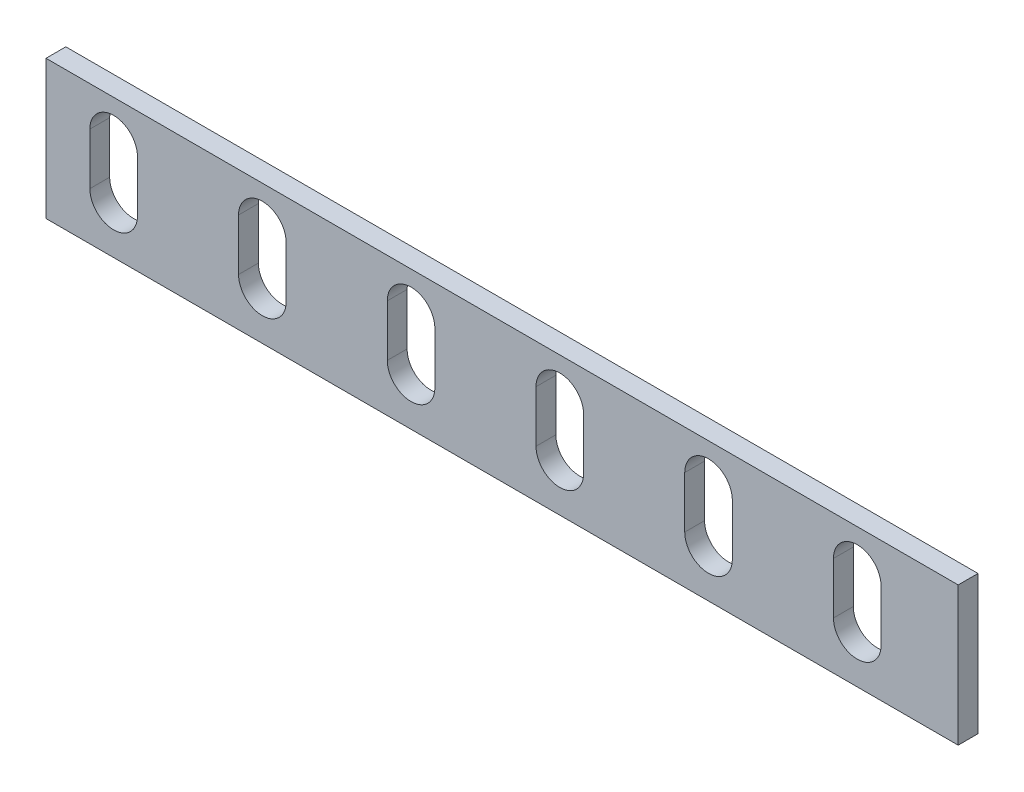
ISO-10303-21;
HEADER;
FILE_DESCRIPTION(('STEP AP214'),'2;1');
FILE_NAME('part.step','',(''),(''),'','','');
FILE_SCHEMA(('AUTOMOTIVE_DESIGN { 1 0 10303 214 1 1 1 1 }'));
ENDSEC;
DATA;
#1=APPLICATION_CONTEXT('core data for automotive mechanical design processes');
#2=APPLICATION_PROTOCOL_DEFINITION('international standard','automotive_design',2000,#1);
#3=PRODUCT_CONTEXT('',#1,'mechanical');
#4=PRODUCT('Part','Part','',(#3));
#5=PRODUCT_RELATED_PRODUCT_CATEGORY('part','',(#4));
#6=PRODUCT_DEFINITION_FORMATION('','',#4);
#7=PRODUCT_DEFINITION_CONTEXT('part definition',#1,'design');
#8=PRODUCT_DEFINITION('design','',#6,#7);
#9=PRODUCT_DEFINITION_SHAPE('','',#8);
#10=(LENGTH_UNIT() NAMED_UNIT(*) SI_UNIT(.MILLI.,.METRE.));
#11=(NAMED_UNIT(*) PLANE_ANGLE_UNIT() SI_UNIT($,.RADIAN.));
#12=(NAMED_UNIT(*) SI_UNIT($,.STERADIAN.) SOLID_ANGLE_UNIT());
#13=UNCERTAINTY_MEASURE_WITH_UNIT(LENGTH_MEASURE(1.E-05),#10,'distance_accuracy_value','');
#14=(GEOMETRIC_REPRESENTATION_CONTEXT(3) GLOBAL_UNCERTAINTY_ASSIGNED_CONTEXT((#13)) GLOBAL_UNIT_ASSIGNED_CONTEXT((#10,
#11,#12)) REPRESENTATION_CONTEXT('',''));
#15=CARTESIAN_POINT('',(0.,0.,0.));
#16=DIRECTION('',(0.,0.,1.));
#17=DIRECTION('',(1.,0.,0.));
#18=AXIS2_PLACEMENT_3D('',#15,#16,#17);
#19=CARTESIAN_POINT('',(0.,0.,20.));
#20=DIRECTION('',(0.,0.,1.));
#21=DIRECTION('',(1.,0.,0.));
#22=AXIS2_PLACEMENT_3D('',#19,#20,#21);
#23=PLANE('',#22);
#24=DIRECTION('',(0.,-1.,0.));
#25=VECTOR('',#24,1.);
#26=CARTESIAN_POINT('',(-450.373949579832,112.521008403362,20.));
#27=LINE('',#26,#25);
#28=CARTESIAN_POINT('',(-450.373949579832,112.521008403362,20.));
#29=VERTEX_POINT('',#28);
#30=CARTESIAN_POINT('',(-450.373949579832,-27.4789915966385,20.));
#31=VERTEX_POINT('',#30);
#32=EDGE_CURVE('E488',#29,#31,#27,.T.);
#33=ORIENTED_EDGE('',*,*,#32,.T.);
#34=DIRECTION('',(1.,0.,0.));
#35=VECTOR('',#34,1.);
#36=CARTESIAN_POINT('',(-450.373949579832,-27.4789915966385,20.));
#37=LINE('',#36,#35);
#38=CARTESIAN_POINT('',(469.626050420168,-27.4789915966385,20.));
#39=VERTEX_POINT('',#38);
#40=EDGE_CURVE('E492',#31,#39,#37,.T.);
#41=ORIENTED_EDGE('',*,*,#40,.T.);
#42=DIRECTION('',(0.,1.,0.));
#43=VECTOR('',#42,1.);
#44=CARTESIAN_POINT('',(469.626050420168,112.521008403362,20.));
#45=LINE('',#44,#43);
#46=CARTESIAN_POINT('',(469.626050420168,112.521008403362,20.));
#47=VERTEX_POINT('',#46);
#48=EDGE_CURVE('E496',#39,#47,#45,.T.);
#49=ORIENTED_EDGE('',*,*,#48,.T.);
#50=DIRECTION('',(-1.,0.,0.));
#51=VECTOR('',#50,1.);
#52=CARTESIAN_POINT('',(-450.373949579832,112.521008403362,20.));
#53=LINE('',#52,#51);
#54=EDGE_CURVE('E499',#47,#29,#53,.T.);
#55=ORIENTED_EDGE('',*,*,#54,.T.);
#56=EDGE_LOOP('',(#33,#41,#49,#55));
#57=FACE_BOUND('',#56,.T.);
#58=DIRECTION('',(0.,-1.,0.));
#59=VECTOR('',#58,1.);
#60=CARTESIAN_POINT('',(-406.161990973654,72.7410615098471,20.));
#61=LINE('',#60,#59);
#62=CARTESIAN_POINT('',(-406.161990973654,72.7410615098471,20.));
#63=VERTEX_POINT('',#62);
#64=CARTESIAN_POINT('',(-406.161990973654,20.7410615098471,20.));
#65=VERTEX_POINT('',#64);
#66=EDGE_CURVE('E448',#63,#65,#61,.T.);
#67=ORIENTED_EDGE('',*,*,#66,.F.);
#68=CARTESIAN_POINT('',(-382.161990973654,72.7410615098471,20.));
#69=DIRECTION('',(0.,0.,1.));
#70=DIRECTION('',(1.,0.,0.));
#71=AXIS2_PLACEMENT_3D('',#68,#69,#70);
#72=CIRCLE('',#71,24.);
#73=CARTESIAN_POINT('',(-358.161990973654,72.7410615098471,20.));
#74=VERTEX_POINT('',#73);
#75=EDGE_CURVE('E445',#74,#63,#72,.T.);
#76=ORIENTED_EDGE('',*,*,#75,.F.);
#77=DIRECTION('',(0.,1.,0.));
#78=VECTOR('',#77,1.);
#79=CARTESIAN_POINT('',(-358.161990973654,72.7410615098471,20.));
#80=LINE('',#79,#78);
#81=CARTESIAN_POINT('',(-358.161990973654,20.7410615098471,20.));
#82=VERTEX_POINT('',#81);
#83=EDGE_CURVE('E456',#82,#74,#80,.T.);
#84=ORIENTED_EDGE('',*,*,#83,.F.);
#85=CARTESIAN_POINT('',(-382.161990973654,20.7410615098471,20.));
#86=DIRECTION('',(0.,0.,1.));
#87=DIRECTION('',(1.,0.,0.));
#88=AXIS2_PLACEMENT_3D('',#85,#86,#87);
#89=CIRCLE('',#88,24.);
#90=EDGE_CURVE('E452',#65,#82,#89,.T.);
#91=ORIENTED_EDGE('',*,*,#90,.F.);
#92=EDGE_LOOP('',(#67,#76,#84,#91));
#93=FACE_BOUND('',#92,.T.);
#94=DIRECTION('',(0.,-1.,0.));
#95=VECTOR('',#94,1.);
#96=CARTESIAN_POINT('',(-256.161990973654,72.7410615098471,20.));
#97=LINE('',#96,#95);
#98=CARTESIAN_POINT('',(-256.161990973654,72.7410615098471,20.));
#99=VERTEX_POINT('',#98);
#100=CARTESIAN_POINT('',(-256.161990973654,20.7410615098471,20.));
#101=VERTEX_POINT('',#100);
#102=EDGE_CURVE('E405',#99,#101,#97,.T.);
#103=ORIENTED_EDGE('',*,*,#102,.F.);
#104=CARTESIAN_POINT('',(-232.161990973654,72.7410615098471,20.));
#105=DIRECTION('',(0.,0.,1.));
#106=DIRECTION('',(1.,0.,0.));
#107=AXIS2_PLACEMENT_3D('',#104,#105,#106);
#108=CIRCLE('',#107,24.);
#109=CARTESIAN_POINT('',(-208.161990973654,72.7410615098471,20.));
#110=VERTEX_POINT('',#109);
#111=EDGE_CURVE('E402',#110,#99,#108,.T.);
#112=ORIENTED_EDGE('',*,*,#111,.F.);
#113=DIRECTION('',(0.,1.,0.));
#114=VECTOR('',#113,1.);
#115=CARTESIAN_POINT('',(-208.161990973654,72.7410615098471,20.));
#116=LINE('',#115,#114);
#117=CARTESIAN_POINT('',(-208.161990973654,20.7410615098471,20.));
#118=VERTEX_POINT('',#117);
#119=EDGE_CURVE('E413',#118,#110,#116,.T.);
#120=ORIENTED_EDGE('',*,*,#119,.F.);
#121=CARTESIAN_POINT('',(-232.161990973654,20.7410615098471,20.));
#122=DIRECTION('',(0.,0.,1.));
#123=DIRECTION('',(1.,0.,0.));
#124=AXIS2_PLACEMENT_3D('',#121,#122,#123);
#125=CIRCLE('',#124,24.);
#126=EDGE_CURVE('E409',#101,#118,#125,.T.);
#127=ORIENTED_EDGE('',*,*,#126,.F.);
#128=EDGE_LOOP('',(#103,#112,#120,#127));
#129=FACE_BOUND('',#128,.T.);
#130=DIRECTION('',(0.,-1.,0.));
#131=VECTOR('',#130,1.);
#132=CARTESIAN_POINT('',(-106.161990973654,72.7410615098471,20.));
#133=LINE('',#132,#131);
#134=CARTESIAN_POINT('',(-106.161990973654,72.7410615098471,20.));
#135=VERTEX_POINT('',#134);
#136=CARTESIAN_POINT('',(-106.161990973654,20.7410615098471,20.));
#137=VERTEX_POINT('',#136);
#138=EDGE_CURVE('E362',#135,#137,#133,.T.);
#139=ORIENTED_EDGE('',*,*,#138,.F.);
#140=CARTESIAN_POINT('',(-82.1619909736538,72.7410615098471,20.));
#141=DIRECTION('',(0.,0.,1.));
#142=DIRECTION('',(1.,0.,0.));
#143=AXIS2_PLACEMENT_3D('',#140,#141,#142);
#144=CIRCLE('',#143,24.);
#145=CARTESIAN_POINT('',(-58.1619909736538,72.7410615098471,20.));
#146=VERTEX_POINT('',#145);
#147=EDGE_CURVE('E359',#146,#135,#144,.T.);
#148=ORIENTED_EDGE('',*,*,#147,.F.);
#149=DIRECTION('',(0.,1.,0.));
#150=VECTOR('',#149,1.);
#151=CARTESIAN_POINT('',(-58.1619909736538,72.7410615098471,20.));
#152=LINE('',#151,#150);
#153=CARTESIAN_POINT('',(-58.1619909736538,20.7410615098471,20.));
#154=VERTEX_POINT('',#153);
#155=EDGE_CURVE('E370',#154,#146,#152,.T.);
#156=ORIENTED_EDGE('',*,*,#155,.F.);
#157=CARTESIAN_POINT('',(-82.1619909736538,20.7410615098471,20.));
#158=DIRECTION('',(0.,0.,1.));
#159=DIRECTION('',(1.,0.,0.));
#160=AXIS2_PLACEMENT_3D('',#157,#158,#159);
#161=CIRCLE('',#160,24.);
#162=EDGE_CURVE('E366',#137,#154,#161,.T.);
#163=ORIENTED_EDGE('',*,*,#162,.F.);
#164=EDGE_LOOP('',(#139,#148,#156,#163));
#165=FACE_BOUND('',#164,.T.);
#166=DIRECTION('',(0.,-1.,0.));
#167=VECTOR('',#166,1.);
#168=CARTESIAN_POINT('',(43.8380090263462,72.7410615098471,20.));
#169=LINE('',#168,#167);
#170=CARTESIAN_POINT('',(43.8380090263462,72.7410615098471,20.));
#171=VERTEX_POINT('',#170);
#172=CARTESIAN_POINT('',(43.8380090263462,20.7410615098471,20.));
#173=VERTEX_POINT('',#172);
#174=EDGE_CURVE('E319',#171,#173,#169,.T.);
#175=ORIENTED_EDGE('',*,*,#174,.F.);
#176=CARTESIAN_POINT('',(67.8380090263462,72.7410615098471,20.));
#177=DIRECTION('',(0.,0.,1.));
#178=DIRECTION('',(1.,0.,0.));
#179=AXIS2_PLACEMENT_3D('',#176,#177,#178);
#180=CIRCLE('',#179,24.);
#181=CARTESIAN_POINT('',(91.8380090263462,72.7410615098471,20.));
#182=VERTEX_POINT('',#181);
#183=EDGE_CURVE('E316',#182,#171,#180,.T.);
#184=ORIENTED_EDGE('',*,*,#183,.F.);
#185=DIRECTION('',(0.,1.,0.));
#186=VECTOR('',#185,1.);
#187=CARTESIAN_POINT('',(91.8380090263462,72.7410615098471,20.));
#188=LINE('',#187,#186);
#189=CARTESIAN_POINT('',(91.8380090263462,20.7410615098471,20.));
#190=VERTEX_POINT('',#189);
#191=EDGE_CURVE('E327',#190,#182,#188,.T.);
#192=ORIENTED_EDGE('',*,*,#191,.F.);
#193=CARTESIAN_POINT('',(67.8380090263462,20.7410615098471,20.));
#194=DIRECTION('',(0.,0.,1.));
#195=DIRECTION('',(1.,0.,0.));
#196=AXIS2_PLACEMENT_3D('',#193,#194,#195);
#197=CIRCLE('',#196,24.);
#198=EDGE_CURVE('E323',#173,#190,#197,.T.);
#199=ORIENTED_EDGE('',*,*,#198,.F.);
#200=EDGE_LOOP('',(#175,#184,#192,#199));
#201=FACE_BOUND('',#200,.T.);
#202=DIRECTION('',(0.,-1.,0.));
#203=VECTOR('',#202,1.);
#204=CARTESIAN_POINT('',(193.838009026346,72.7410615098471,20.));
#205=LINE('',#204,#203);
#206=CARTESIAN_POINT('',(193.838009026346,72.7410615098471,20.));
#207=VERTEX_POINT('',#206);
#208=CARTESIAN_POINT('',(193.838009026346,20.7410615098471,20.));
#209=VERTEX_POINT('',#208);
#210=EDGE_CURVE('E276',#207,#209,#205,.T.);
#211=ORIENTED_EDGE('',*,*,#210,.F.);
#212=CARTESIAN_POINT('',(217.838009026346,72.7410615098471,20.));
#213=DIRECTION('',(0.,0.,1.));
#214=DIRECTION('',(1.,0.,0.));
#215=AXIS2_PLACEMENT_3D('',#212,#213,#214);
#216=CIRCLE('',#215,24.);
#217=CARTESIAN_POINT('',(241.838009026346,72.7410615098471,20.));
#218=VERTEX_POINT('',#217);
#219=EDGE_CURVE('E273',#218,#207,#216,.T.);
#220=ORIENTED_EDGE('',*,*,#219,.F.);
#221=DIRECTION('',(0.,1.,0.));
#222=VECTOR('',#221,1.);
#223=CARTESIAN_POINT('',(241.838009026346,72.7410615098471,20.));
#224=LINE('',#223,#222);
#225=CARTESIAN_POINT('',(241.838009026346,20.7410615098471,20.));
#226=VERTEX_POINT('',#225);
#227=EDGE_CURVE('E284',#226,#218,#224,.T.);
#228=ORIENTED_EDGE('',*,*,#227,.F.);
#229=CARTESIAN_POINT('',(217.838009026346,20.7410615098471,20.));
#230=DIRECTION('',(0.,0.,1.));
#231=DIRECTION('',(1.,0.,0.));
#232=AXIS2_PLACEMENT_3D('',#229,#230,#231);
#233=CIRCLE('',#232,24.);
#234=EDGE_CURVE('E280',#209,#226,#233,.T.);
#235=ORIENTED_EDGE('',*,*,#234,.F.);
#236=EDGE_LOOP('',(#211,#220,#228,#235));
#237=FACE_BOUND('',#236,.T.);
#238=DIRECTION('',(0.,-1.,0.));
#239=VECTOR('',#238,1.);
#240=CARTESIAN_POINT('',(343.838009026346,72.7410615098471,20.));
#241=LINE('',#240,#239);
#242=CARTESIAN_POINT('',(343.838009026346,72.7410615098471,20.));
#243=VERTEX_POINT('',#242);
#244=CARTESIAN_POINT('',(343.838009026346,20.7410615098471,20.));
#245=VERTEX_POINT('',#244);
#246=EDGE_CURVE('E234',#243,#245,#241,.T.);
#247=ORIENTED_EDGE('',*,*,#246,.F.);
#248=CARTESIAN_POINT('',(367.838009026346,72.7410615098471,20.));
#249=DIRECTION('',(0.,0.,1.));
#250=DIRECTION('',(1.,0.,0.));
#251=AXIS2_PLACEMENT_3D('',#248,#249,#250);
#252=CIRCLE('',#251,24.);
#253=CARTESIAN_POINT('',(391.838009026346,72.7410615098471,20.));
#254=VERTEX_POINT('',#253);
#255=EDGE_CURVE('E225',#254,#243,#252,.T.);
#256=ORIENTED_EDGE('',*,*,#255,.F.);
#257=DIRECTION('',(0.,1.,0.));
#258=VECTOR('',#257,1.);
#259=CARTESIAN_POINT('',(391.838009026346,72.7410615098471,20.));
#260=LINE('',#259,#258);
#261=CARTESIAN_POINT('',(391.838009026346,20.7410615098471,20.));
#262=VERTEX_POINT('',#261);
#263=EDGE_CURVE('E251',#262,#254,#260,.T.);
#264=ORIENTED_EDGE('',*,*,#263,.F.);
#265=CARTESIAN_POINT('',(367.838009026346,20.7410615098471,20.));
#266=DIRECTION('',(0.,0.,1.));
#267=DIRECTION('',(1.,0.,0.));
#268=AXIS2_PLACEMENT_3D('',#265,#266,#267);
#269=CIRCLE('',#268,24.);
#270=EDGE_CURVE('E247',#245,#262,#269,.T.);
#271=ORIENTED_EDGE('',*,*,#270,.F.);
#272=EDGE_LOOP('',(#247,#256,#264,#271));
#273=FACE_BOUND('',#272,.T.);
#274=ADVANCED_FACE('F39',(#57,#93,#129,#165,#201,#237,#273),#23,.T.);
#275=CARTESIAN_POINT('',(0.,0.,0.));
#276=DIRECTION('',(0.,0.,1.));
#277=DIRECTION('',(1.,0.,0.));
#278=AXIS2_PLACEMENT_3D('',#275,#276,#277);
#279=PLANE('',#278);
#280=CARTESIAN_POINT('',(217.838009026346,72.7410615098471,0.));
#281=DIRECTION('',(0.,0.,1.));
#282=DIRECTION('',(1.,0.,0.));
#283=AXIS2_PLACEMENT_3D('',#280,#281,#282);
#284=CIRCLE('',#283,24.);
#285=CARTESIAN_POINT('',(241.838009026346,72.7410615098471,0.));
#286=VERTEX_POINT('',#285);
#287=CARTESIAN_POINT('',(193.838009026346,72.7410615098471,0.));
#288=VERTEX_POINT('',#287);
#289=EDGE_CURVE('E243',#286,#288,#284,.T.);
#290=ORIENTED_EDGE('',*,*,#289,.T.);
#291=DIRECTION('',(0.,-1.,0.));
#292=VECTOR('',#291,1.);
#293=CARTESIAN_POINT('',(193.838009026346,72.7410615098471,0.));
#294=LINE('',#293,#292);
#295=CARTESIAN_POINT('',(193.838009026346,20.7410615098471,0.));
#296=VERTEX_POINT('',#295);
#297=EDGE_CURVE('E291',#288,#296,#294,.T.);
#298=ORIENTED_EDGE('',*,*,#297,.T.);
#299=CARTESIAN_POINT('',(217.838009026346,20.7410615098471,0.));
#300=DIRECTION('',(0.,0.,1.));
#301=DIRECTION('',(1.,0.,0.));
#302=AXIS2_PLACEMENT_3D('',#299,#300,#301);
#303=CIRCLE('',#302,24.);
#304=CARTESIAN_POINT('',(241.838009026346,20.7410615098471,0.));
#305=VERTEX_POINT('',#304);
#306=EDGE_CURVE('E295',#296,#305,#303,.T.);
#307=ORIENTED_EDGE('',*,*,#306,.T.);
#308=DIRECTION('',(0.,1.,0.));
#309=VECTOR('',#308,1.);
#310=CARTESIAN_POINT('',(241.838009026346,72.7410615098471,0.));
#311=LINE('',#310,#309);
#312=EDGE_CURVE('E277',#305,#286,#311,.T.);
#313=ORIENTED_EDGE('',*,*,#312,.T.);
#314=EDGE_LOOP('',(#290,#298,#307,#313));
#315=FACE_BOUND('',#314,.T.);
#316=CARTESIAN_POINT('',(-82.1619909736538,72.7410615098471,0.));
#317=DIRECTION('',(0.,0.,1.));
#318=DIRECTION('',(1.,0.,0.));
#319=AXIS2_PLACEMENT_3D('',#316,#317,#318);
#320=CIRCLE('',#319,24.);
#321=CARTESIAN_POINT('',(-58.1619909736538,72.7410615098471,0.));
#322=VERTEX_POINT('',#321);
#323=CARTESIAN_POINT('',(-106.161990973654,72.7410615098471,0.));
#324=VERTEX_POINT('',#323);
#325=EDGE_CURVE('E358',#322,#324,#320,.T.);
#326=ORIENTED_EDGE('',*,*,#325,.T.);
#327=DIRECTION('',(0.,-1.,0.));
#328=VECTOR('',#327,1.);
#329=CARTESIAN_POINT('',(-106.161990973654,72.7410615098471,0.));
#330=LINE('',#329,#328);
#331=CARTESIAN_POINT('',(-106.161990973654,20.7410615098471,0.));
#332=VERTEX_POINT('',#331);
#333=EDGE_CURVE('E377',#324,#332,#330,.T.);
#334=ORIENTED_EDGE('',*,*,#333,.T.);
#335=CARTESIAN_POINT('',(-82.1619909736538,20.7410615098471,0.));
#336=DIRECTION('',(0.,0.,1.));
#337=DIRECTION('',(1.,0.,0.));
#338=AXIS2_PLACEMENT_3D('',#335,#336,#337);
#339=CIRCLE('',#338,24.);
#340=CARTESIAN_POINT('',(-58.1619909736538,20.7410615098471,0.));
#341=VERTEX_POINT('',#340);
#342=EDGE_CURVE('E381',#332,#341,#339,.T.);
#343=ORIENTED_EDGE('',*,*,#342,.T.);
#344=DIRECTION('',(0.,1.,0.));
#345=VECTOR('',#344,1.);
#346=CARTESIAN_POINT('',(-58.1619909736538,72.7410615098471,0.));
#347=LINE('',#346,#345);
#348=EDGE_CURVE('E363',#341,#322,#347,.T.);
#349=ORIENTED_EDGE('',*,*,#348,.T.);
#350=EDGE_LOOP('',(#326,#334,#343,#349));
#351=FACE_BOUND('',#350,.T.);
#352=CARTESIAN_POINT('',(-382.161990973654,72.7410615098471,0.));
#353=DIRECTION('',(0.,0.,1.));
#354=DIRECTION('',(1.,0.,0.));
#355=AXIS2_PLACEMENT_3D('',#352,#353,#354);
#356=CIRCLE('',#355,24.);
#357=CARTESIAN_POINT('',(-358.161990973654,72.7410615098471,0.));
#358=VERTEX_POINT('',#357);
#359=CARTESIAN_POINT('',(-406.161990973654,72.7410615098471,0.));
#360=VERTEX_POINT('',#359);
#361=EDGE_CURVE('E444',#358,#360,#356,.T.);
#362=ORIENTED_EDGE('',*,*,#361,.T.);
#363=DIRECTION('',(0.,-1.,0.));
#364=VECTOR('',#363,1.);
#365=CARTESIAN_POINT('',(-406.161990973654,72.7410615098471,0.));
#366=LINE('',#365,#364);
#367=CARTESIAN_POINT('',(-406.161990973654,20.7410615098471,0.));
#368=VERTEX_POINT('',#367);
#369=EDGE_CURVE('E463',#360,#368,#366,.T.);
#370=ORIENTED_EDGE('',*,*,#369,.T.);
#371=CARTESIAN_POINT('',(-382.161990973654,20.7410615098471,0.));
#372=DIRECTION('',(0.,0.,1.));
#373=DIRECTION('',(1.,0.,0.));
#374=AXIS2_PLACEMENT_3D('',#371,#372,#373);
#375=CIRCLE('',#374,24.);
#376=CARTESIAN_POINT('',(-358.161990973654,20.7410615098471,0.));
#377=VERTEX_POINT('',#376);
#378=EDGE_CURVE('E467',#368,#377,#375,.T.);
#379=ORIENTED_EDGE('',*,*,#378,.T.);
#380=DIRECTION('',(0.,1.,0.));
#381=VECTOR('',#380,1.);
#382=CARTESIAN_POINT('',(-358.161990973654,72.7410615098471,0.));
#383=LINE('',#382,#381);
#384=EDGE_CURVE('E449',#377,#358,#383,.T.);
#385=ORIENTED_EDGE('',*,*,#384,.T.);
#386=EDGE_LOOP('',(#362,#370,#379,#385));
#387=FACE_BOUND('',#386,.T.);
#388=DIRECTION('',(0.,-1.,0.));
#389=VECTOR('',#388,1.);
#390=CARTESIAN_POINT('',(-450.373949579832,112.521008403362,0.));
#391=LINE('',#390,#389);
#392=CARTESIAN_POINT('',(-450.373949579832,112.521008403362,0.));
#393=VERTEX_POINT('',#392);
#394=CARTESIAN_POINT('',(-450.373949579832,-27.4789915966385,0.));
#395=VERTEX_POINT('',#394);
#396=EDGE_CURVE('E487',#393,#395,#391,.T.);
#397=ORIENTED_EDGE('',*,*,#396,.F.);
#398=DIRECTION('',(-1.,0.,0.));
#399=VECTOR('',#398,1.);
#400=CARTESIAN_POINT('',(-450.373949579832,112.521008403362,0.));
#401=LINE('',#400,#399);
#402=CARTESIAN_POINT('',(469.626050420168,112.521008403362,0.));
#403=VERTEX_POINT('',#402);
#404=EDGE_CURVE('E493',#403,#393,#401,.T.);
#405=ORIENTED_EDGE('',*,*,#404,.F.);
#406=DIRECTION('',(0.,1.,0.));
#407=VECTOR('',#406,1.);
#408=CARTESIAN_POINT('',(469.626050420168,112.521008403362,0.));
#409=LINE('',#408,#407);
#410=CARTESIAN_POINT('',(469.626050420168,-27.4789915966385,0.));
#411=VERTEX_POINT('',#410);
#412=EDGE_CURVE('E509',#411,#403,#409,.T.);
#413=ORIENTED_EDGE('',*,*,#412,.F.);
#414=DIRECTION('',(1.,0.,0.));
#415=VECTOR('',#414,1.);
#416=CARTESIAN_POINT('',(-450.373949579832,-27.4789915966385,0.));
#417=LINE('',#416,#415);
#418=EDGE_CURVE('E506',#395,#411,#417,.T.);
#419=ORIENTED_EDGE('',*,*,#418,.F.);
#420=EDGE_LOOP('',(#397,#405,#413,#419));
#421=FACE_BOUND('',#420,.T.);
#422=CARTESIAN_POINT('',(-232.161990973654,72.7410615098471,0.));
#423=DIRECTION('',(0.,0.,1.));
#424=DIRECTION('',(1.,0.,0.));
#425=AXIS2_PLACEMENT_3D('',#422,#423,#424);
#426=CIRCLE('',#425,24.);
#427=CARTESIAN_POINT('',(-208.161990973654,72.7410615098471,0.));
#428=VERTEX_POINT('',#427);
#429=CARTESIAN_POINT('',(-256.161990973654,72.7410615098471,0.));
#430=VERTEX_POINT('',#429);
#431=EDGE_CURVE('E401',#428,#430,#426,.T.);
#432=ORIENTED_EDGE('',*,*,#431,.T.);
#433=DIRECTION('',(0.,-1.,0.));
#434=VECTOR('',#433,1.);
#435=CARTESIAN_POINT('',(-256.161990973654,72.7410615098471,0.));
#436=LINE('',#435,#434);
#437=CARTESIAN_POINT('',(-256.161990973654,20.7410615098471,0.));
#438=VERTEX_POINT('',#437);
#439=EDGE_CURVE('E420',#430,#438,#436,.T.);
#440=ORIENTED_EDGE('',*,*,#439,.T.);
#441=CARTESIAN_POINT('',(-232.161990973654,20.7410615098471,0.));
#442=DIRECTION('',(0.,0.,1.));
#443=DIRECTION('',(1.,0.,0.));
#444=AXIS2_PLACEMENT_3D('',#441,#442,#443);
#445=CIRCLE('',#444,24.);
#446=CARTESIAN_POINT('',(-208.161990973654,20.7410615098471,0.));
#447=VERTEX_POINT('',#446);
#448=EDGE_CURVE('E424',#438,#447,#445,.T.);
#449=ORIENTED_EDGE('',*,*,#448,.T.);
#450=DIRECTION('',(0.,1.,0.));
#451=VECTOR('',#450,1.);
#452=CARTESIAN_POINT('',(-208.161990973654,72.7410615098471,0.));
#453=LINE('',#452,#451);
#454=EDGE_CURVE('E406',#447,#428,#453,.T.);
#455=ORIENTED_EDGE('',*,*,#454,.T.);
#456=EDGE_LOOP('',(#432,#440,#449,#455));
#457=FACE_BOUND('',#456,.T.);
#458=CARTESIAN_POINT('',(67.8380090263462,72.7410615098471,0.));
#459=DIRECTION('',(0.,0.,1.));
#460=DIRECTION('',(1.,0.,0.));
#461=AXIS2_PLACEMENT_3D('',#458,#459,#460);
#462=CIRCLE('',#461,24.);
#463=CARTESIAN_POINT('',(91.8380090263462,72.7410615098471,0.));
#464=VERTEX_POINT('',#463);
#465=CARTESIAN_POINT('',(43.8380090263462,72.7410615098471,0.));
#466=VERTEX_POINT('',#465);
#467=EDGE_CURVE('E315',#464,#466,#462,.T.);
#468=ORIENTED_EDGE('',*,*,#467,.T.);
#469=DIRECTION('',(0.,-1.,0.));
#470=VECTOR('',#469,1.);
#471=CARTESIAN_POINT('',(43.8380090263462,72.7410615098471,0.));
#472=LINE('',#471,#470);
#473=CARTESIAN_POINT('',(43.8380090263462,20.7410615098471,0.));
#474=VERTEX_POINT('',#473);
#475=EDGE_CURVE('E334',#466,#474,#472,.T.);
#476=ORIENTED_EDGE('',*,*,#475,.T.);
#477=CARTESIAN_POINT('',(67.8380090263462,20.7410615098471,0.));
#478=DIRECTION('',(0.,0.,1.));
#479=DIRECTION('',(1.,0.,0.));
#480=AXIS2_PLACEMENT_3D('',#477,#478,#479);
#481=CIRCLE('',#480,24.);
#482=CARTESIAN_POINT('',(91.8380090263462,20.7410615098471,0.));
#483=VERTEX_POINT('',#482);
#484=EDGE_CURVE('E338',#474,#483,#481,.T.);
#485=ORIENTED_EDGE('',*,*,#484,.T.);
#486=DIRECTION('',(0.,1.,0.));
#487=VECTOR('',#486,1.);
#488=CARTESIAN_POINT('',(91.8380090263462,72.7410615098471,0.));
#489=LINE('',#488,#487);
#490=EDGE_CURVE('E320',#483,#464,#489,.T.);
#491=ORIENTED_EDGE('',*,*,#490,.T.);
#492=EDGE_LOOP('',(#468,#476,#485,#491));
#493=FACE_BOUND('',#492,.T.);
#494=CARTESIAN_POINT('',(367.838009026346,72.7410615098471,0.));
#495=DIRECTION('',(0.,0.,1.));
#496=DIRECTION('',(1.,0.,0.));
#497=AXIS2_PLACEMENT_3D('',#494,#495,#496);
#498=CIRCLE('',#497,24.);
#499=CARTESIAN_POINT('',(391.838009026346,72.7410615098471,0.));
#500=VERTEX_POINT('',#499);
#501=CARTESIAN_POINT('',(343.838009026346,72.7410615098471,0.));
#502=VERTEX_POINT('',#501);
#503=EDGE_CURVE('E63',#500,#502,#498,.T.);
#504=ORIENTED_EDGE('',*,*,#503,.T.);
#505=DIRECTION('',(0.,-1.,0.));
#506=VECTOR('',#505,1.);
#507=CARTESIAN_POINT('',(343.838009026346,72.7410615098471,0.));
#508=LINE('',#507,#506);
#509=CARTESIAN_POINT('',(343.838009026346,20.7410615098471,0.));
#510=VERTEX_POINT('',#509);
#511=EDGE_CURVE('E241',#502,#510,#508,.T.);
#512=ORIENTED_EDGE('',*,*,#511,.T.);
#513=CARTESIAN_POINT('',(367.838009026346,20.7410615098471,0.));
#514=DIRECTION('',(0.,0.,1.));
#515=DIRECTION('',(1.,0.,0.));
#516=AXIS2_PLACEMENT_3D('',#513,#514,#515);
#517=CIRCLE('',#516,24.);
#518=CARTESIAN_POINT('',(391.838009026346,20.7410615098471,0.));
#519=VERTEX_POINT('',#518);
#520=EDGE_CURVE('E260',#510,#519,#517,.T.);
#521=ORIENTED_EDGE('',*,*,#520,.T.);
#522=DIRECTION('',(0.,1.,0.));
#523=VECTOR('',#522,1.);
#524=CARTESIAN_POINT('',(391.838009026346,72.7410615098471,0.));
#525=LINE('',#524,#523);
#526=EDGE_CURVE('E235',#519,#500,#525,.T.);
#527=ORIENTED_EDGE('',*,*,#526,.T.);
#528=EDGE_LOOP('',(#504,#512,#521,#527));
#529=FACE_BOUND('',#528,.T.);
#530=ADVANCED_FACE('F532',(#315,#351,#387,#421,#457,#493,#529),#279,.F.);
#531=CARTESIAN_POINT('',(-450.373949579832,112.521008403362,20.));
#532=DIRECTION('',(1.,0.,0.));
#533=DIRECTION('',(0.,0.,-1.));
#534=AXIS2_PLACEMENT_3D('',#531,#532,#533);
#535=PLANE('',#534);
#536=ORIENTED_EDGE('',*,*,#396,.T.);
#537=DIRECTION('',(0.,0.,-1.));
#538=VECTOR('',#537,1.);
#539=CARTESIAN_POINT('',(-450.373949579832,-27.4789915966385,20.));
#540=LINE('',#539,#538);
#541=EDGE_CURVE('E11',#31,#395,#540,.T.);
#542=ORIENTED_EDGE('',*,*,#541,.F.);
#543=ORIENTED_EDGE('',*,*,#32,.F.);
#544=DIRECTION('',(0.,0.,-1.));
#545=VECTOR('',#544,1.);
#546=CARTESIAN_POINT('',(-450.373949579832,112.521008403362,20.));
#547=LINE('',#546,#545);
#548=EDGE_CURVE('E502',#29,#393,#547,.T.);
#549=ORIENTED_EDGE('',*,*,#548,.T.);
#550=EDGE_LOOP('',(#536,#542,#543,#549));
#551=FACE_BOUND('',#550,.T.);
#552=ADVANCED_FACE('F41',(#551),#535,.F.);
#553=CARTESIAN_POINT('',(-450.373949579832,-27.4789915966385,20.));
#554=DIRECTION('',(0.,1.,0.));
#555=DIRECTION('',(0.,0.,1.));
#556=AXIS2_PLACEMENT_3D('',#553,#554,#555);
#557=PLANE('',#556);
#558=ORIENTED_EDGE('',*,*,#418,.T.);
#559=DIRECTION('',(0.,0.,-1.));
#560=VECTOR('',#559,1.);
#561=CARTESIAN_POINT('',(469.626050420168,-27.4789915966385,20.));
#562=LINE('',#561,#560);
#563=EDGE_CURVE('E48',#39,#411,#562,.T.);
#564=ORIENTED_EDGE('',*,*,#563,.F.);
#565=ORIENTED_EDGE('',*,*,#40,.F.);
#566=ORIENTED_EDGE('',*,*,#541,.T.);
#567=EDGE_LOOP('',(#558,#564,#565,#566));
#568=FACE_BOUND('',#567,.T.);
#569=ADVANCED_FACE('F543',(#568),#557,.F.);
#570=CARTESIAN_POINT('',(469.626050420168,112.521008403362,20.));
#571=DIRECTION('',(-1.,0.,0.));
#572=DIRECTION('',(0.,-1.,0.));
#573=AXIS2_PLACEMENT_3D('',#570,#571,#572);
#574=PLANE('',#573);
#575=ORIENTED_EDGE('',*,*,#412,.T.);
#576=DIRECTION('',(0.,0.,-1.));
#577=VECTOR('',#576,1.);
#578=CARTESIAN_POINT('',(469.626050420168,112.521008403362,20.));
#579=LINE('',#578,#577);
#580=EDGE_CURVE('E517',#47,#403,#579,.T.);
#581=ORIENTED_EDGE('',*,*,#580,.F.);
#582=ORIENTED_EDGE('',*,*,#48,.F.);
#583=ORIENTED_EDGE('',*,*,#563,.T.);
#584=EDGE_LOOP('',(#575,#581,#582,#583));
#585=FACE_BOUND('',#584,.T.);
#586=ADVANCED_FACE('F526',(#585),#574,.F.);
#587=CARTESIAN_POINT('',(-450.373949579832,112.521008403362,20.));
#588=DIRECTION('',(0.,-1.,0.));
#589=DIRECTION('',(0.,0.,-1.));
#590=AXIS2_PLACEMENT_3D('',#587,#588,#589);
#591=PLANE('',#590);
#592=ORIENTED_EDGE('',*,*,#404,.T.);
#593=ORIENTED_EDGE('',*,*,#548,.F.);
#594=ORIENTED_EDGE('',*,*,#54,.F.);
#595=ORIENTED_EDGE('',*,*,#580,.T.);
#596=EDGE_LOOP('',(#592,#593,#594,#595));
#597=FACE_BOUND('',#596,.T.);
#598=ADVANCED_FACE('F536',(#597),#591,.F.);
#599=CARTESIAN_POINT('',(-382.161990973654,72.7410615098471,20.));
#600=DIRECTION('',(0.,0.,-1.));
#601=DIRECTION('',(-1.,0.,0.));
#602=AXIS2_PLACEMENT_3D('',#599,#600,#601);
#603=CYLINDRICAL_SURFACE('',#602,24.);
#604=ORIENTED_EDGE('',*,*,#361,.F.);
#605=DIRECTION('',(0.,0.,-1.));
#606=VECTOR('',#605,1.);
#607=CARTESIAN_POINT('',(-358.161990973654,72.7410615098471,20.));
#608=LINE('',#607,#606);
#609=EDGE_CURVE('E459',#74,#358,#608,.T.);
#610=ORIENTED_EDGE('',*,*,#609,.F.);
#611=ORIENTED_EDGE('',*,*,#75,.T.);
#612=DIRECTION('',(0.,0.,-1.));
#613=VECTOR('',#612,1.);
#614=CARTESIAN_POINT('',(-406.161990973654,72.7410615098471,20.));
#615=LINE('',#614,#613);
#616=EDGE_CURVE('E483',#63,#360,#615,.T.);
#617=ORIENTED_EDGE('',*,*,#616,.T.);
#618=EDGE_LOOP('',(#604,#610,#611,#617));
#619=FACE_BOUND('',#618,.T.);
#620=ADVANCED_FACE('F558',(#619),#603,.F.);
#621=CARTESIAN_POINT('',(-406.161990973654,72.7410615098471,20.));
#622=DIRECTION('',(1.,0.,0.));
#623=DIRECTION('',(0.,0.,-1.));
#624=AXIS2_PLACEMENT_3D('',#621,#622,#623);
#625=PLANE('',#624);
#626=ORIENTED_EDGE('',*,*,#369,.F.);
#627=ORIENTED_EDGE('',*,*,#616,.F.);
#628=ORIENTED_EDGE('',*,*,#66,.T.);
#629=DIRECTION('',(0.,0.,-1.));
#630=VECTOR('',#629,1.);
#631=CARTESIAN_POINT('',(-406.161990973654,20.7410615098471,20.));
#632=LINE('',#631,#630);
#633=EDGE_CURVE('E480',#65,#368,#632,.T.);
#634=ORIENTED_EDGE('',*,*,#633,.T.);
#635=EDGE_LOOP('',(#626,#627,#628,#634));
#636=FACE_BOUND('',#635,.T.);
#637=ADVANCED_FACE('F565',(#636),#625,.T.);
#638=CARTESIAN_POINT('',(-382.161990973654,20.7410615098471,20.));
#639=DIRECTION('',(0.,0.,-1.));
#640=DIRECTION('',(-1.,0.,0.));
#641=AXIS2_PLACEMENT_3D('',#638,#639,#640);
#642=CYLINDRICAL_SURFACE('',#641,24.);
#643=ORIENTED_EDGE('',*,*,#378,.F.);
#644=ORIENTED_EDGE('',*,*,#633,.F.);
#645=ORIENTED_EDGE('',*,*,#90,.T.);
#646=DIRECTION('',(0.,0.,-1.));
#647=VECTOR('',#646,1.);
#648=CARTESIAN_POINT('',(-358.161990973654,20.7410615098471,20.));
#649=LINE('',#648,#647);
#650=EDGE_CURVE('E477',#82,#377,#649,.T.);
#651=ORIENTED_EDGE('',*,*,#650,.T.);
#652=EDGE_LOOP('',(#643,#644,#645,#651));
#653=FACE_BOUND('',#652,.T.);
#654=ADVANCED_FACE('F570',(#653),#642,.F.);
#655=CARTESIAN_POINT('',(-358.161990973654,72.7410615098471,20.));
#656=DIRECTION('',(-1.,0.,0.));
#657=DIRECTION('',(0.,0.,1.));
#658=AXIS2_PLACEMENT_3D('',#655,#656,#657);
#659=PLANE('',#658);
#660=ORIENTED_EDGE('',*,*,#384,.F.);
#661=ORIENTED_EDGE('',*,*,#650,.F.);
#662=ORIENTED_EDGE('',*,*,#83,.T.);
#663=ORIENTED_EDGE('',*,*,#609,.T.);
#664=EDGE_LOOP('',(#660,#661,#662,#663));
#665=FACE_BOUND('',#664,.T.);
#666=ADVANCED_FACE('F578',(#665),#659,.T.);
#667=CARTESIAN_POINT('',(-232.161990973654,72.7410615098471,20.));
#668=DIRECTION('',(0.,0.,-1.));
#669=DIRECTION('',(-1.,0.,0.));
#670=AXIS2_PLACEMENT_3D('',#667,#668,#669);
#671=CYLINDRICAL_SURFACE('',#670,24.);
#672=ORIENTED_EDGE('',*,*,#431,.F.);
#673=DIRECTION('',(0.,0.,-1.));
#674=VECTOR('',#673,1.);
#675=CARTESIAN_POINT('',(-208.161990973654,72.7410615098471,20.));
#676=LINE('',#675,#674);
#677=EDGE_CURVE('E416',#110,#428,#676,.T.);
#678=ORIENTED_EDGE('',*,*,#677,.F.);
#679=ORIENTED_EDGE('',*,*,#111,.T.);
#680=DIRECTION('',(0.,0.,-1.));
#681=VECTOR('',#680,1.);
#682=CARTESIAN_POINT('',(-256.161990973654,72.7410615098471,20.));
#683=LINE('',#682,#681);
#684=EDGE_CURVE('E440',#99,#430,#683,.T.);
#685=ORIENTED_EDGE('',*,*,#684,.T.);
#686=EDGE_LOOP('',(#672,#678,#679,#685));
#687=FACE_BOUND('',#686,.T.);
#688=ADVANCED_FACE('F673',(#687),#671,.F.);
#689=CARTESIAN_POINT('',(-256.161990973654,72.7410615098471,20.));
#690=DIRECTION('',(1.,0.,0.));
#691=DIRECTION('',(0.,0.,-1.));
#692=AXIS2_PLACEMENT_3D('',#689,#690,#691);
#693=PLANE('',#692);
#694=ORIENTED_EDGE('',*,*,#439,.F.);
#695=ORIENTED_EDGE('',*,*,#684,.F.);
#696=ORIENTED_EDGE('',*,*,#102,.T.);
#697=DIRECTION('',(0.,0.,-1.));
#698=VECTOR('',#697,1.);
#699=CARTESIAN_POINT('',(-256.161990973654,20.7410615098471,20.));
#700=LINE('',#699,#698);
#701=EDGE_CURVE('E437',#101,#438,#700,.T.);
#702=ORIENTED_EDGE('',*,*,#701,.T.);
#703=EDGE_LOOP('',(#694,#695,#696,#702));
#704=FACE_BOUND('',#703,.T.);
#705=ADVANCED_FACE('F669',(#704),#693,.T.);
#706=CARTESIAN_POINT('',(-232.161990973654,20.7410615098471,20.));
#707=DIRECTION('',(0.,0.,-1.));
#708=DIRECTION('',(-1.,0.,0.));
#709=AXIS2_PLACEMENT_3D('',#706,#707,#708);
#710=CYLINDRICAL_SURFACE('',#709,24.);
#711=ORIENTED_EDGE('',*,*,#448,.F.);
#712=ORIENTED_EDGE('',*,*,#701,.F.);
#713=ORIENTED_EDGE('',*,*,#126,.T.);
#714=DIRECTION('',(0.,0.,-1.));
#715=VECTOR('',#714,1.);
#716=CARTESIAN_POINT('',(-208.161990973654,20.7410615098471,20.));
#717=LINE('',#716,#715);
#718=EDGE_CURVE('E434',#118,#447,#717,.T.);
#719=ORIENTED_EDGE('',*,*,#718,.T.);
#720=EDGE_LOOP('',(#711,#712,#713,#719));
#721=FACE_BOUND('',#720,.T.);
#722=ADVANCED_FACE('F665',(#721),#710,.F.);
#723=CARTESIAN_POINT('',(-208.161990973654,72.7410615098471,20.));
#724=DIRECTION('',(-1.,0.,0.));
#725=DIRECTION('',(0.,0.,1.));
#726=AXIS2_PLACEMENT_3D('',#723,#724,#725);
#727=PLANE('',#726);
#728=ORIENTED_EDGE('',*,*,#454,.F.);
#729=ORIENTED_EDGE('',*,*,#718,.F.);
#730=ORIENTED_EDGE('',*,*,#119,.T.);
#731=ORIENTED_EDGE('',*,*,#677,.T.);
#732=EDGE_LOOP('',(#728,#729,#730,#731));
#733=FACE_BOUND('',#732,.T.);
#734=ADVANCED_FACE('F661',(#733),#727,.T.);
#735=CARTESIAN_POINT('',(-82.1619909736538,72.7410615098471,20.));
#736=DIRECTION('',(0.,0.,-1.));
#737=DIRECTION('',(-1.,0.,0.));
#738=AXIS2_PLACEMENT_3D('',#735,#736,#737);
#739=CYLINDRICAL_SURFACE('',#738,24.);
#740=ORIENTED_EDGE('',*,*,#325,.F.);
#741=DIRECTION('',(0.,0.,-1.));
#742=VECTOR('',#741,1.);
#743=CARTESIAN_POINT('',(-58.1619909736538,72.7410615098471,20.));
#744=LINE('',#743,#742);
#745=EDGE_CURVE('E373',#146,#322,#744,.T.);
#746=ORIENTED_EDGE('',*,*,#745,.F.);
#747=ORIENTED_EDGE('',*,*,#147,.T.);
#748=DIRECTION('',(0.,0.,-1.));
#749=VECTOR('',#748,1.);
#750=CARTESIAN_POINT('',(-106.161990973654,72.7410615098471,20.));
#751=LINE('',#750,#749);
#752=EDGE_CURVE('E397',#135,#324,#751,.T.);
#753=ORIENTED_EDGE('',*,*,#752,.T.);
#754=EDGE_LOOP('',(#740,#746,#747,#753));
#755=FACE_BOUND('',#754,.T.);
#756=ADVANCED_FACE('F657',(#755),#739,.F.);
#757=CARTESIAN_POINT('',(-106.161990973654,72.7410615098471,20.));
#758=DIRECTION('',(1.,0.,0.));
#759=DIRECTION('',(0.,0.,-1.));
#760=AXIS2_PLACEMENT_3D('',#757,#758,#759);
#761=PLANE('',#760);
#762=ORIENTED_EDGE('',*,*,#333,.F.);
#763=ORIENTED_EDGE('',*,*,#752,.F.);
#764=ORIENTED_EDGE('',*,*,#138,.T.);
#765=DIRECTION('',(0.,0.,-1.));
#766=VECTOR('',#765,1.);
#767=CARTESIAN_POINT('',(-106.161990973654,20.7410615098471,20.));
#768=LINE('',#767,#766);
#769=EDGE_CURVE('E394',#137,#332,#768,.T.);
#770=ORIENTED_EDGE('',*,*,#769,.T.);
#771=EDGE_LOOP('',(#762,#763,#764,#770));
#772=FACE_BOUND('',#771,.T.);
#773=ADVANCED_FACE('F653',(#772),#761,.T.);
#774=CARTESIAN_POINT('',(-82.1619909736538,20.7410615098471,20.));
#775=DIRECTION('',(0.,0.,-1.));
#776=DIRECTION('',(-1.,0.,0.));
#777=AXIS2_PLACEMENT_3D('',#774,#775,#776);
#778=CYLINDRICAL_SURFACE('',#777,24.);
#779=ORIENTED_EDGE('',*,*,#342,.F.);
#780=ORIENTED_EDGE('',*,*,#769,.F.);
#781=ORIENTED_EDGE('',*,*,#162,.T.);
#782=DIRECTION('',(0.,0.,-1.));
#783=VECTOR('',#782,1.);
#784=CARTESIAN_POINT('',(-58.1619909736538,20.7410615098471,20.));
#785=LINE('',#784,#783);
#786=EDGE_CURVE('E391',#154,#341,#785,.T.);
#787=ORIENTED_EDGE('',*,*,#786,.T.);
#788=EDGE_LOOP('',(#779,#780,#781,#787));
#789=FACE_BOUND('',#788,.T.);
#790=ADVANCED_FACE('F649',(#789),#778,.F.);
#791=CARTESIAN_POINT('',(-58.1619909736538,72.7410615098471,20.));
#792=DIRECTION('',(-1.,0.,0.));
#793=DIRECTION('',(0.,0.,1.));
#794=AXIS2_PLACEMENT_3D('',#791,#792,#793);
#795=PLANE('',#794);
#796=ORIENTED_EDGE('',*,*,#348,.F.);
#797=ORIENTED_EDGE('',*,*,#786,.F.);
#798=ORIENTED_EDGE('',*,*,#155,.T.);
#799=ORIENTED_EDGE('',*,*,#745,.T.);
#800=EDGE_LOOP('',(#796,#797,#798,#799));
#801=FACE_BOUND('',#800,.T.);
#802=ADVANCED_FACE('F645',(#801),#795,.T.);
#803=CARTESIAN_POINT('',(67.8380090263462,72.7410615098471,20.));
#804=DIRECTION('',(0.,0.,-1.));
#805=DIRECTION('',(-1.,0.,0.));
#806=AXIS2_PLACEMENT_3D('',#803,#804,#805);
#807=CYLINDRICAL_SURFACE('',#806,24.);
#808=ORIENTED_EDGE('',*,*,#467,.F.);
#809=DIRECTION('',(0.,0.,-1.));
#810=VECTOR('',#809,1.);
#811=CARTESIAN_POINT('',(91.8380090263462,72.7410615098471,20.));
#812=LINE('',#811,#810);
#813=EDGE_CURVE('E330',#182,#464,#812,.T.);
#814=ORIENTED_EDGE('',*,*,#813,.F.);
#815=ORIENTED_EDGE('',*,*,#183,.T.);
#816=DIRECTION('',(0.,0.,-1.));
#817=VECTOR('',#816,1.);
#818=CARTESIAN_POINT('',(43.8380090263462,72.7410615098471,20.));
#819=LINE('',#818,#817);
#820=EDGE_CURVE('E354',#171,#466,#819,.T.);
#821=ORIENTED_EDGE('',*,*,#820,.T.);
#822=EDGE_LOOP('',(#808,#814,#815,#821));
#823=FACE_BOUND('',#822,.T.);
#824=ADVANCED_FACE('F641',(#823),#807,.F.);
#825=CARTESIAN_POINT('',(43.8380090263462,72.7410615098471,20.));
#826=DIRECTION('',(1.,0.,0.));
#827=DIRECTION('',(0.,0.,-1.));
#828=AXIS2_PLACEMENT_3D('',#825,#826,#827);
#829=PLANE('',#828);
#830=ORIENTED_EDGE('',*,*,#475,.F.);
#831=ORIENTED_EDGE('',*,*,#820,.F.);
#832=ORIENTED_EDGE('',*,*,#174,.T.);
#833=DIRECTION('',(0.,0.,-1.));
#834=VECTOR('',#833,1.);
#835=CARTESIAN_POINT('',(43.8380090263462,20.7410615098471,20.));
#836=LINE('',#835,#834);
#837=EDGE_CURVE('E351',#173,#474,#836,.T.);
#838=ORIENTED_EDGE('',*,*,#837,.T.);
#839=EDGE_LOOP('',(#830,#831,#832,#838));
#840=FACE_BOUND('',#839,.T.);
#841=ADVANCED_FACE('F637',(#840),#829,.T.);
#842=CARTESIAN_POINT('',(67.8380090263462,20.7410615098471,20.));
#843=DIRECTION('',(0.,0.,-1.));
#844=DIRECTION('',(-1.,0.,0.));
#845=AXIS2_PLACEMENT_3D('',#842,#843,#844);
#846=CYLINDRICAL_SURFACE('',#845,24.);
#847=ORIENTED_EDGE('',*,*,#484,.F.);
#848=ORIENTED_EDGE('',*,*,#837,.F.);
#849=ORIENTED_EDGE('',*,*,#198,.T.);
#850=DIRECTION('',(0.,0.,-1.));
#851=VECTOR('',#850,1.);
#852=CARTESIAN_POINT('',(91.8380090263462,20.7410615098471,20.));
#853=LINE('',#852,#851);
#854=EDGE_CURVE('E348',#190,#483,#853,.T.);
#855=ORIENTED_EDGE('',*,*,#854,.T.);
#856=EDGE_LOOP('',(#847,#848,#849,#855));
#857=FACE_BOUND('',#856,.T.);
#858=ADVANCED_FACE('F633',(#857),#846,.F.);
#859=CARTESIAN_POINT('',(91.8380090263462,72.7410615098471,20.));
#860=DIRECTION('',(-1.,0.,0.));
#861=DIRECTION('',(0.,0.,1.));
#862=AXIS2_PLACEMENT_3D('',#859,#860,#861);
#863=PLANE('',#862);
#864=ORIENTED_EDGE('',*,*,#490,.F.);
#865=ORIENTED_EDGE('',*,*,#854,.F.);
#866=ORIENTED_EDGE('',*,*,#191,.T.);
#867=ORIENTED_EDGE('',*,*,#813,.T.);
#868=EDGE_LOOP('',(#864,#865,#866,#867));
#869=FACE_BOUND('',#868,.T.);
#870=ADVANCED_FACE('F630',(#869),#863,.T.);
#871=CARTESIAN_POINT('',(217.838009026346,72.7410615098471,20.));
#872=DIRECTION('',(0.,0.,-1.));
#873=DIRECTION('',(-1.,0.,0.));
#874=AXIS2_PLACEMENT_3D('',#871,#872,#873);
#875=CYLINDRICAL_SURFACE('',#874,24.);
#876=ORIENTED_EDGE('',*,*,#289,.F.);
#877=DIRECTION('',(0.,0.,-1.));
#878=VECTOR('',#877,1.);
#879=CARTESIAN_POINT('',(241.838009026346,72.7410615098471,20.));
#880=LINE('',#879,#878);
#881=EDGE_CURVE('E287',#218,#286,#880,.T.);
#882=ORIENTED_EDGE('',*,*,#881,.F.);
#883=ORIENTED_EDGE('',*,*,#219,.T.);
#884=DIRECTION('',(0.,0.,-1.));
#885=VECTOR('',#884,1.);
#886=CARTESIAN_POINT('',(193.838009026346,72.7410615098471,20.));
#887=LINE('',#886,#885);
#888=EDGE_CURVE('E311',#207,#288,#887,.T.);
#889=ORIENTED_EDGE('',*,*,#888,.T.);
#890=EDGE_LOOP('',(#876,#882,#883,#889));
#891=FACE_BOUND('',#890,.T.);
#892=ADVANCED_FACE('F612',(#891),#875,.F.);
#893=CARTESIAN_POINT('',(193.838009026346,72.7410615098471,20.));
#894=DIRECTION('',(1.,0.,0.));
#895=DIRECTION('',(0.,0.,-1.));
#896=AXIS2_PLACEMENT_3D('',#893,#894,#895);
#897=PLANE('',#896);
#898=ORIENTED_EDGE('',*,*,#297,.F.);
#899=ORIENTED_EDGE('',*,*,#888,.F.);
#900=ORIENTED_EDGE('',*,*,#210,.T.);
#901=DIRECTION('',(0.,0.,-1.));
#902=VECTOR('',#901,1.);
#903=CARTESIAN_POINT('',(193.838009026346,20.7410615098471,20.));
#904=LINE('',#903,#902);
#905=EDGE_CURVE('E308',#209,#296,#904,.T.);
#906=ORIENTED_EDGE('',*,*,#905,.T.);
#907=EDGE_LOOP('',(#898,#899,#900,#906));
#908=FACE_BOUND('',#907,.T.);
#909=ADVANCED_FACE('F605',(#908),#897,.T.);
#910=CARTESIAN_POINT('',(217.838009026346,20.7410615098471,20.));
#911=DIRECTION('',(0.,0.,-1.));
#912=DIRECTION('',(-1.,0.,0.));
#913=AXIS2_PLACEMENT_3D('',#910,#911,#912);
#914=CYLINDRICAL_SURFACE('',#913,24.);
#915=ORIENTED_EDGE('',*,*,#306,.F.);
#916=ORIENTED_EDGE('',*,*,#905,.F.);
#917=ORIENTED_EDGE('',*,*,#234,.T.);
#918=DIRECTION('',(0.,0.,-1.));
#919=VECTOR('',#918,1.);
#920=CARTESIAN_POINT('',(241.838009026346,20.7410615098471,20.));
#921=LINE('',#920,#919);
#922=EDGE_CURVE('E305',#226,#305,#921,.T.);
#923=ORIENTED_EDGE('',*,*,#922,.T.);
#924=EDGE_LOOP('',(#915,#916,#917,#923));
#925=FACE_BOUND('',#924,.T.);
#926=ADVANCED_FACE('F608',(#925),#914,.F.);
#927=CARTESIAN_POINT('',(241.838009026346,72.7410615098471,20.));
#928=DIRECTION('',(-1.,0.,0.));
#929=DIRECTION('',(0.,0.,1.));
#930=AXIS2_PLACEMENT_3D('',#927,#928,#929);
#931=PLANE('',#930);
#932=ORIENTED_EDGE('',*,*,#312,.F.);
#933=ORIENTED_EDGE('',*,*,#922,.F.);
#934=ORIENTED_EDGE('',*,*,#227,.T.);
#935=ORIENTED_EDGE('',*,*,#881,.T.);
#936=EDGE_LOOP('',(#932,#933,#934,#935));
#937=FACE_BOUND('',#936,.T.);
#938=ADVANCED_FACE('F615',(#937),#931,.T.);
#939=CARTESIAN_POINT('',(367.838009026346,72.7410615098471,20.));
#940=DIRECTION('',(0.,0.,-1.));
#941=DIRECTION('',(-1.,0.,0.));
#942=AXIS2_PLACEMENT_3D('',#939,#940,#941);
#943=CYLINDRICAL_SURFACE('',#942,24.);
#944=ORIENTED_EDGE('',*,*,#503,.F.);
#945=DIRECTION('',(0.,0.,-1.));
#946=VECTOR('',#945,1.);
#947=CARTESIAN_POINT('',(391.838009026346,72.7410615098471,20.));
#948=LINE('',#947,#946);
#949=EDGE_CURVE('E229',#254,#500,#948,.T.);
#950=ORIENTED_EDGE('',*,*,#949,.F.);
#951=ORIENTED_EDGE('',*,*,#255,.T.);
#952=DIRECTION('',(0.,0.,-1.));
#953=VECTOR('',#952,1.);
#954=CARTESIAN_POINT('',(343.838009026346,72.7410615098471,20.));
#955=LINE('',#954,#953);
#956=EDGE_CURVE('E228',#243,#502,#955,.T.);
#957=ORIENTED_EDGE('',*,*,#956,.T.);
#958=EDGE_LOOP('',(#944,#950,#951,#957));
#959=FACE_BOUND('',#958,.T.);
#960=ADVANCED_FACE('F227',(#959),#943,.F.);
#961=CARTESIAN_POINT('',(343.838009026346,72.7410615098471,20.));
#962=DIRECTION('',(1.,0.,0.));
#963=DIRECTION('',(0.,0.,-1.));
#964=AXIS2_PLACEMENT_3D('',#961,#962,#963);
#965=PLANE('',#964);
#966=ORIENTED_EDGE('',*,*,#511,.F.);
#967=ORIENTED_EDGE('',*,*,#956,.F.);
#968=ORIENTED_EDGE('',*,*,#246,.T.);
#969=DIRECTION('',(0.,0.,-1.));
#970=VECTOR('',#969,1.);
#971=CARTESIAN_POINT('',(343.838009026346,20.7410615098471,20.));
#972=LINE('',#971,#970);
#973=EDGE_CURVE('E244',#245,#510,#972,.T.);
#974=ORIENTED_EDGE('',*,*,#973,.T.);
#975=EDGE_LOOP('',(#966,#967,#968,#974));
#976=FACE_BOUND('',#975,.T.);
#977=ADVANCED_FACE('F238',(#976),#965,.T.);
#978=CARTESIAN_POINT('',(367.838009026346,20.7410615098471,20.));
#979=DIRECTION('',(0.,0.,-1.));
#980=DIRECTION('',(-1.,0.,0.));
#981=AXIS2_PLACEMENT_3D('',#978,#979,#980);
#982=CYLINDRICAL_SURFACE('',#981,24.);
#983=ORIENTED_EDGE('',*,*,#520,.F.);
#984=ORIENTED_EDGE('',*,*,#973,.F.);
#985=ORIENTED_EDGE('',*,*,#270,.T.);
#986=DIRECTION('',(0.,0.,-1.));
#987=VECTOR('',#986,1.);
#988=CARTESIAN_POINT('',(391.838009026346,20.7410615098471,20.));
#989=LINE('',#988,#987);
#990=EDGE_CURVE('E55',#262,#519,#989,.T.);
#991=ORIENTED_EDGE('',*,*,#990,.T.);
#992=EDGE_LOOP('',(#983,#984,#985,#991));
#993=FACE_BOUND('',#992,.T.);
#994=ADVANCED_FACE('F768',(#993),#982,.F.);
#995=CARTESIAN_POINT('',(391.838009026346,72.7410615098471,20.));
#996=DIRECTION('',(-1.,0.,0.));
#997=DIRECTION('',(0.,0.,1.));
#998=AXIS2_PLACEMENT_3D('',#995,#996,#997);
#999=PLANE('',#998);
#1000=ORIENTED_EDGE('',*,*,#526,.F.);
#1001=ORIENTED_EDGE('',*,*,#990,.F.);
#1002=ORIENTED_EDGE('',*,*,#263,.T.);
#1003=ORIENTED_EDGE('',*,*,#949,.T.);
#1004=EDGE_LOOP('',(#1000,#1001,#1002,#1003));
#1005=FACE_BOUND('',#1004,.T.);
#1006=ADVANCED_FACE('F776',(#1005),#999,.T.);
#1007=CLOSED_SHELL('',(#274,#530,#552,#569,#586,#598,#620,#637,#654,#666,#688,#705,#722,#734,
#756,#773,#790,#802,#824,#841,#858,#870,#892,#909,#926,#938,#960,#977,#994,#1006));
#1008=MANIFOLD_SOLID_BREP('B2',#1007);
#1009=ADVANCED_BREP_SHAPE_REPRESENTATION('',(#18,#1008),#14);
#1010=SHAPE_DEFINITION_REPRESENTATION(#9,#1009);
ENDSEC;
END-ISO-10303-21;
